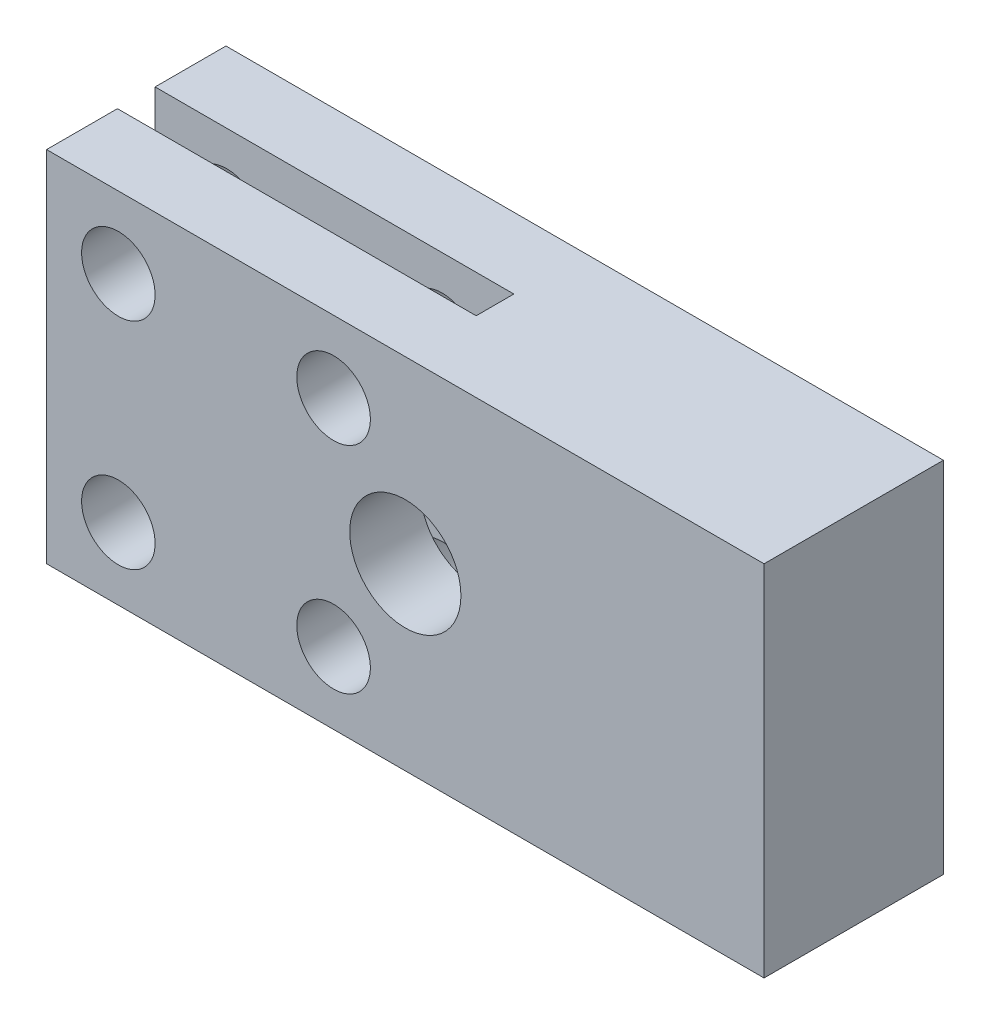
ISO-10303-21;
HEADER;
FILE_DESCRIPTION(('STEP AP214'),'2;1');
FILE_NAME('part.step','',(''),(''),'','','');
FILE_SCHEMA(('AUTOMOTIVE_DESIGN { 1 0 10303 214 1 1 1 1 }'));
ENDSEC;
DATA;
#1=APPLICATION_CONTEXT('core data for automotive mechanical design processes');
#2=APPLICATION_PROTOCOL_DEFINITION('international standard','automotive_design',2000,#1);
#3=PRODUCT_CONTEXT('',#1,'mechanical');
#4=PRODUCT('Part','Part','',(#3));
#5=PRODUCT_RELATED_PRODUCT_CATEGORY('part','',(#4));
#6=PRODUCT_DEFINITION_FORMATION('','',#4);
#7=PRODUCT_DEFINITION_CONTEXT('part definition',#1,'design');
#8=PRODUCT_DEFINITION('design','',#6,#7);
#9=PRODUCT_DEFINITION_SHAPE('','',#8);
#10=(LENGTH_UNIT() NAMED_UNIT(*) SI_UNIT(.MILLI.,.METRE.));
#11=(NAMED_UNIT(*) PLANE_ANGLE_UNIT() SI_UNIT($,.RADIAN.));
#12=(NAMED_UNIT(*) SI_UNIT($,.STERADIAN.) SOLID_ANGLE_UNIT());
#13=UNCERTAINTY_MEASURE_WITH_UNIT(LENGTH_MEASURE(1.E-05),#10,'distance_accuracy_value','');
#14=(GEOMETRIC_REPRESENTATION_CONTEXT(3) GLOBAL_UNCERTAINTY_ASSIGNED_CONTEXT((#13)) GLOBAL_UNIT_ASSIGNED_CONTEXT((#10,
#11,#12)) REPRESENTATION_CONTEXT('',''));
#15=CARTESIAN_POINT('',(0.,0.,0.));
#16=DIRECTION('',(0.,0.,1.));
#17=DIRECTION('',(1.,0.,0.));
#18=AXIS2_PLACEMENT_3D('',#15,#16,#17);
#19=CARTESIAN_POINT('',(-20.,9.99999999999998,10.));
#20=DIRECTION('',(1.,0.,0.));
#21=DIRECTION('',(0.,1.,0.));
#22=AXIS2_PLACEMENT_3D('',#19,#20,#21);
#23=PLANE('',#22);
#24=DIRECTION('',(0.,0.,-1.));
#25=VECTOR('',#24,1.);
#26=CARTESIAN_POINT('',(-20.,-10.,10.));
#27=LINE('',#26,#25);
#28=CARTESIAN_POINT('',(-20.,-10.,3.95));
#29=VERTEX_POINT('',#28);
#30=CARTESIAN_POINT('',(-20.,-10.,0.));
#31=VERTEX_POINT('',#30);
#32=EDGE_CURVE('E182',#29,#31,#27,.T.);
#33=ORIENTED_EDGE('',*,*,#32,.F.);
#34=DIRECTION('',(0.,1.,0.));
#35=VECTOR('',#34,1.);
#36=CARTESIAN_POINT('',(-20.,9.99999999999998,3.95));
#37=LINE('',#36,#35);
#38=CARTESIAN_POINT('',(-20.,10.,3.95));
#39=VERTEX_POINT('',#38);
#40=EDGE_CURVE('E145',#29,#39,#37,.T.);
#41=ORIENTED_EDGE('',*,*,#40,.T.);
#42=DIRECTION('',(0.,0.,-1.));
#43=VECTOR('',#42,1.);
#44=CARTESIAN_POINT('',(-20.,9.99999999999998,10.));
#45=LINE('',#44,#43);
#46=CARTESIAN_POINT('',(-20.,9.99999999999998,0.));
#47=VERTEX_POINT('',#46);
#48=EDGE_CURVE('E165',#39,#47,#45,.T.);
#49=ORIENTED_EDGE('',*,*,#48,.T.);
#50=DIRECTION('',(0.,-1.,0.));
#51=VECTOR('',#50,1.);
#52=CARTESIAN_POINT('',(-20.,9.99999999999998,0.));
#53=LINE('',#52,#51);
#54=EDGE_CURVE('E152',#47,#31,#53,.T.);
#55=ORIENTED_EDGE('',*,*,#54,.T.);
#56=EDGE_LOOP('',(#33,#41,#49,#55));
#57=FACE_BOUND('',#56,.T.);
#58=ADVANCED_FACE('F32',(#57),#23,.F.);
#59=CARTESIAN_POINT('',(-20.,9.99999999999998,10.));
#60=VERTEX_POINT('',#59);
#61=CARTESIAN_POINT('',(-20.,9.99999999999998,6.05));
#62=VERTEX_POINT('',#61);
#63=EDGE_CURVE('E174',#60,#62,#45,.T.);
#64=ORIENTED_EDGE('',*,*,#63,.T.);
#65=DIRECTION('',(0.,-1.,0.));
#66=VECTOR('',#65,1.);
#67=CARTESIAN_POINT('',(-20.,9.99999999999998,6.05));
#68=LINE('',#67,#66);
#69=CARTESIAN_POINT('',(-20.,-10.,6.05));
#70=VERTEX_POINT('',#69);
#71=EDGE_CURVE('E49',#62,#70,#68,.T.);
#72=ORIENTED_EDGE('',*,*,#71,.T.);
#73=CARTESIAN_POINT('',(-20.,-10.,10.));
#74=VERTEX_POINT('',#73);
#75=EDGE_CURVE('E183',#74,#70,#27,.T.);
#76=ORIENTED_EDGE('',*,*,#75,.F.);
#77=DIRECTION('',(0.,-1.,0.));
#78=VECTOR('',#77,1.);
#79=CARTESIAN_POINT('',(-20.,9.99999999999998,10.));
#80=LINE('',#79,#78);
#81=EDGE_CURVE('E155',#60,#74,#80,.T.);
#82=ORIENTED_EDGE('',*,*,#81,.F.);
#83=EDGE_LOOP('',(#64,#72,#76,#82));
#84=FACE_BOUND('',#83,.T.);
#85=ADVANCED_FACE('F34',(#84),#23,.F.);
#86=CARTESIAN_POINT('',(20.,-10.,10.));
#87=DIRECTION('',(0.,1.,0.));
#88=DIRECTION('',(0.,0.,1.));
#89=AXIS2_PLACEMENT_3D('',#86,#87,#88);
#90=PLANE('',#89);
#91=DIRECTION('',(0.,0.,1.));
#92=VECTOR('',#91,1.);
#93=CARTESIAN_POINT('',(0.,-10.,6.05));
#94=LINE('',#93,#92);
#95=CARTESIAN_POINT('',(0.,-10.,3.95));
#96=VERTEX_POINT('',#95);
#97=CARTESIAN_POINT('',(0.,-10.,6.05));
#98=VERTEX_POINT('',#97);
#99=EDGE_CURVE('E138',#96,#98,#94,.T.);
#100=ORIENTED_EDGE('',*,*,#99,.F.);
#101=DIRECTION('',(1.,0.,0.));
#102=VECTOR('',#101,1.);
#103=CARTESIAN_POINT('',(-40.,-10.,3.95));
#104=LINE('',#103,#102);
#105=EDGE_CURVE('E128',#29,#96,#104,.T.);
#106=ORIENTED_EDGE('',*,*,#105,.F.);
#107=ORIENTED_EDGE('',*,*,#32,.T.);
#108=DIRECTION('',(1.,0.,0.));
#109=VECTOR('',#108,1.);
#110=CARTESIAN_POINT('',(20.,-10.,0.));
#111=LINE('',#110,#109);
#112=CARTESIAN_POINT('',(20.,-10.,0.));
#113=VERTEX_POINT('',#112);
#114=EDGE_CURVE('E168',#31,#113,#111,.T.);
#115=ORIENTED_EDGE('',*,*,#114,.T.);
#116=DIRECTION('',(0.,0.,-1.));
#117=VECTOR('',#116,1.);
#118=CARTESIAN_POINT('',(20.,-10.,10.));
#119=LINE('',#118,#117);
#120=CARTESIAN_POINT('',(20.,-10.,10.));
#121=VERTEX_POINT('',#120);
#122=EDGE_CURVE('E179',#121,#113,#119,.T.);
#123=ORIENTED_EDGE('',*,*,#122,.F.);
#124=DIRECTION('',(1.,0.,0.));
#125=VECTOR('',#124,1.);
#126=CARTESIAN_POINT('',(20.,-10.,10.));
#127=LINE('',#126,#125);
#128=EDGE_CURVE('E158',#74,#121,#127,.T.);
#129=ORIENTED_EDGE('',*,*,#128,.F.);
#130=ORIENTED_EDGE('',*,*,#75,.T.);
#131=DIRECTION('',(-1.,0.,0.));
#132=VECTOR('',#131,1.);
#133=CARTESIAN_POINT('',(-40.,-10.,6.05));
#134=LINE('',#133,#132);
#135=EDGE_CURVE('E131',#98,#70,#134,.T.);
#136=ORIENTED_EDGE('',*,*,#135,.F.);
#137=EDGE_LOOP('',(#100,#106,#107,#115,#123,#129,#130,#136));
#138=FACE_BOUND('',#137,.T.);
#139=ADVANCED_FACE('F249',(#138),#90,.F.);
#140=CARTESIAN_POINT('',(20.,10.,10.));
#141=DIRECTION('',(-1.,0.,0.));
#142=DIRECTION('',(0.,-1.,0.));
#143=AXIS2_PLACEMENT_3D('',#140,#141,#142);
#144=PLANE('',#143);
#145=DIRECTION('',(0.,1.,0.));
#146=VECTOR('',#145,1.);
#147=CARTESIAN_POINT('',(20.,10.,0.));
#148=LINE('',#147,#146);
#149=CARTESIAN_POINT('',(20.,10.,0.));
#150=VERTEX_POINT('',#149);
#151=EDGE_CURVE('E170',#113,#150,#148,.T.);
#152=ORIENTED_EDGE('',*,*,#151,.T.);
#153=DIRECTION('',(0.,0.,-1.));
#154=VECTOR('',#153,1.);
#155=CARTESIAN_POINT('',(20.,10.,10.));
#156=LINE('',#155,#154);
#157=CARTESIAN_POINT('',(20.,10.,10.));
#158=VERTEX_POINT('',#157);
#159=EDGE_CURVE('E176',#158,#150,#156,.T.);
#160=ORIENTED_EDGE('',*,*,#159,.F.);
#161=DIRECTION('',(0.,1.,0.));
#162=VECTOR('',#161,1.);
#163=CARTESIAN_POINT('',(20.,10.,10.));
#164=LINE('',#163,#162);
#165=EDGE_CURVE('E161',#121,#158,#164,.T.);
#166=ORIENTED_EDGE('',*,*,#165,.F.);
#167=ORIENTED_EDGE('',*,*,#122,.T.);
#168=EDGE_LOOP('',(#152,#160,#166,#167));
#169=FACE_BOUND('',#168,.T.);
#170=ADVANCED_FACE('F245',(#169),#144,.F.);
#171=CARTESIAN_POINT('',(20.,10.,10.));
#172=DIRECTION('',(0.,-1.,0.));
#173=DIRECTION('',(1.,0.,0.));
#174=AXIS2_PLACEMENT_3D('',#171,#172,#173);
#175=PLANE('',#174);
#176=ORIENTED_EDGE('',*,*,#48,.F.);
#177=DIRECTION('',(1.,0.,0.));
#178=VECTOR('',#177,1.);
#179=CARTESIAN_POINT('',(-40.,10.,3.95));
#180=LINE('',#179,#178);
#181=CARTESIAN_POINT('',(0.,10.,3.95));
#182=VERTEX_POINT('',#181);
#183=EDGE_CURVE('E124',#39,#182,#180,.T.);
#184=ORIENTED_EDGE('',*,*,#183,.T.);
#185=DIRECTION('',(0.,0.,1.));
#186=VECTOR('',#185,1.);
#187=CARTESIAN_POINT('',(0.,10.,6.05));
#188=LINE('',#187,#186);
#189=CARTESIAN_POINT('',(0.,10.,6.05));
#190=VERTEX_POINT('',#189);
#191=EDGE_CURVE('E112',#182,#190,#188,.T.);
#192=ORIENTED_EDGE('',*,*,#191,.T.);
#193=DIRECTION('',(-1.,0.,0.));
#194=VECTOR('',#193,1.);
#195=CARTESIAN_POINT('',(-40.,10.,6.05));
#196=LINE('',#195,#194);
#197=EDGE_CURVE('E119',#190,#62,#196,.T.);
#198=ORIENTED_EDGE('',*,*,#197,.T.);
#199=ORIENTED_EDGE('',*,*,#63,.F.);
#200=DIRECTION('',(-1.,0.,0.));
#201=VECTOR('',#200,1.);
#202=CARTESIAN_POINT('',(20.,10.,10.));
#203=LINE('',#202,#201);
#204=EDGE_CURVE('E163',#158,#60,#203,.T.);
#205=ORIENTED_EDGE('',*,*,#204,.F.);
#206=ORIENTED_EDGE('',*,*,#159,.T.);
#207=DIRECTION('',(-1.,0.,0.));
#208=VECTOR('',#207,1.);
#209=CARTESIAN_POINT('',(20.,10.,0.));
#210=LINE('',#209,#208);
#211=EDGE_CURVE('E159',#150,#47,#210,.T.);
#212=ORIENTED_EDGE('',*,*,#211,.T.);
#213=EDGE_LOOP('',(#176,#184,#192,#198,#199,#205,#206,#212));
#214=FACE_BOUND('',#213,.T.);
#215=ADVANCED_FACE('F127',(#214),#175,.F.);
#216=CARTESIAN_POINT('',(0.,0.,10.));
#217=DIRECTION('',(0.,0.,-1.));
#218=DIRECTION('',(-1.,0.,0.));
#219=AXIS2_PLACEMENT_3D('',#216,#217,#218);
#220=PLANE('',#219);
#221=CARTESIAN_POINT('',(-4.,6.,10.));
#222=DIRECTION('',(0.,0.,-1.));
#223=DIRECTION('',(-1.,0.,0.));
#224=AXIS2_PLACEMENT_3D('',#221,#222,#223);
#225=CIRCLE('',#224,2.05);
#226=CARTESIAN_POINT('',(-6.05,6.,10.));
#227=VERTEX_POINT('',#226);
#228=EDGE_CURVE('E199',#227,#227,#225,.T.);
#229=ORIENTED_EDGE('',*,*,#228,.T.);
#230=EDGE_LOOP('',(#229));
#231=FACE_BOUND('',#230,.T.);
#232=CARTESIAN_POINT('',(-4.,-6.,10.));
#233=DIRECTION('',(0.,0.,-1.));
#234=DIRECTION('',(-1.,0.,0.));
#235=AXIS2_PLACEMENT_3D('',#232,#233,#234);
#236=CIRCLE('',#235,2.05);
#237=CARTESIAN_POINT('',(-6.05,-6.,10.));
#238=VERTEX_POINT('',#237);
#239=EDGE_CURVE('E433',#238,#238,#236,.T.);
#240=ORIENTED_EDGE('',*,*,#239,.T.);
#241=EDGE_LOOP('',(#240));
#242=FACE_BOUND('',#241,.T.);
#243=CARTESIAN_POINT('',(-16.,-6.,10.));
#244=DIRECTION('',(0.,0.,-1.));
#245=DIRECTION('',(-1.,0.,0.));
#246=AXIS2_PLACEMENT_3D('',#243,#244,#245);
#247=CIRCLE('',#246,2.05);
#248=CARTESIAN_POINT('',(-18.05,-6.,10.));
#249=VERTEX_POINT('',#248);
#250=EDGE_CURVE('E441',#249,#249,#247,.T.);
#251=ORIENTED_EDGE('',*,*,#250,.T.);
#252=EDGE_LOOP('',(#251));
#253=FACE_BOUND('',#252,.T.);
#254=CARTESIAN_POINT('',(-16.,6.,10.));
#255=DIRECTION('',(0.,0.,-1.));
#256=DIRECTION('',(-1.,0.,0.));
#257=AXIS2_PLACEMENT_3D('',#254,#255,#256);
#258=CIRCLE('',#257,2.05);
#259=CARTESIAN_POINT('',(-18.05,6.,10.));
#260=VERTEX_POINT('',#259);
#261=EDGE_CURVE('E195',#260,#260,#258,.T.);
#262=ORIENTED_EDGE('',*,*,#261,.T.);
#263=EDGE_LOOP('',(#262));
#264=FACE_BOUND('',#263,.T.);
#265=CARTESIAN_POINT('',(0.,0.,10.));
#266=DIRECTION('',(0.,0.,1.));
#267=DIRECTION('',(1.,0.,0.));
#268=AXIS2_PLACEMENT_3D('',#265,#266,#267);
#269=CIRCLE('',#268,3.1);
#270=CARTESIAN_POINT('',(3.1,0.,10.));
#271=VERTEX_POINT('',#270);
#272=EDGE_CURVE('E148',#271,#271,#269,.T.);
#273=ORIENTED_EDGE('',*,*,#272,.F.);
#274=EDGE_LOOP('',(#273));
#275=FACE_BOUND('',#274,.T.);
#276=ORIENTED_EDGE('',*,*,#81,.T.);
#277=ORIENTED_EDGE('',*,*,#128,.T.);
#278=ORIENTED_EDGE('',*,*,#165,.T.);
#279=ORIENTED_EDGE('',*,*,#204,.T.);
#280=EDGE_LOOP('',(#276,#277,#278,#279));
#281=FACE_BOUND('',#280,.T.);
#282=ADVANCED_FACE('F230',(#231,#242,#253,#264,#275,#281),#220,.F.);
#283=CARTESIAN_POINT('',(0.,0.,0.));
#284=DIRECTION('',(0.,0.,-1.));
#285=DIRECTION('',(-1.,0.,0.));
#286=AXIS2_PLACEMENT_3D('',#283,#284,#285);
#287=PLANE('',#286);
#288=CARTESIAN_POINT('',(-4.,6.,0.));
#289=DIRECTION('',(0.,0.,-1.));
#290=DIRECTION('',(-1.,0.,0.));
#291=AXIS2_PLACEMENT_3D('',#288,#289,#290);
#292=CIRCLE('',#291,2.05);
#293=CARTESIAN_POINT('',(-6.05,6.,0.));
#294=VERTEX_POINT('',#293);
#295=EDGE_CURVE('E425',#294,#294,#292,.T.);
#296=ORIENTED_EDGE('',*,*,#295,.F.);
#297=EDGE_LOOP('',(#296));
#298=FACE_BOUND('',#297,.T.);
#299=CARTESIAN_POINT('',(-4.,-6.,0.));
#300=DIRECTION('',(0.,0.,-1.));
#301=DIRECTION('',(-1.,0.,0.));
#302=AXIS2_PLACEMENT_3D('',#299,#300,#301);
#303=CIRCLE('',#302,2.05);
#304=CARTESIAN_POINT('',(-6.05,-6.,0.));
#305=VERTEX_POINT('',#304);
#306=EDGE_CURVE('E437',#305,#305,#303,.T.);
#307=ORIENTED_EDGE('',*,*,#306,.F.);
#308=EDGE_LOOP('',(#307));
#309=FACE_BOUND('',#308,.T.);
#310=CARTESIAN_POINT('',(-16.,-6.,0.));
#311=DIRECTION('',(0.,0.,-1.));
#312=DIRECTION('',(-1.,0.,0.));
#313=AXIS2_PLACEMENT_3D('',#310,#311,#312);
#314=CIRCLE('',#313,2.05);
#315=CARTESIAN_POINT('',(-18.05,-6.,0.));
#316=VERTEX_POINT('',#315);
#317=EDGE_CURVE('E212',#316,#316,#314,.T.);
#318=ORIENTED_EDGE('',*,*,#317,.F.);
#319=EDGE_LOOP('',(#318));
#320=FACE_BOUND('',#319,.T.);
#321=CARTESIAN_POINT('',(-16.,6.,0.));
#322=DIRECTION('',(0.,0.,-1.));
#323=DIRECTION('',(-1.,0.,0.));
#324=AXIS2_PLACEMENT_3D('',#321,#322,#323);
#325=CIRCLE('',#324,2.05);
#326=CARTESIAN_POINT('',(-18.05,6.,0.));
#327=VERTEX_POINT('',#326);
#328=EDGE_CURVE('E218',#327,#327,#325,.T.);
#329=ORIENTED_EDGE('',*,*,#328,.F.);
#330=EDGE_LOOP('',(#329));
#331=FACE_BOUND('',#330,.T.);
#332=CARTESIAN_POINT('',(0.,0.,0.));
#333=DIRECTION('',(0.,0.,1.));
#334=DIRECTION('',(1.,0.,0.));
#335=AXIS2_PLACEMENT_3D('',#332,#333,#334);
#336=CIRCLE('',#335,3.1);
#337=CARTESIAN_POINT('',(3.1,0.,0.));
#338=VERTEX_POINT('',#337);
#339=EDGE_CURVE('E149',#338,#338,#336,.T.);
#340=ORIENTED_EDGE('',*,*,#339,.T.);
#341=EDGE_LOOP('',(#340));
#342=FACE_BOUND('',#341,.T.);
#343=ORIENTED_EDGE('',*,*,#54,.F.);
#344=ORIENTED_EDGE('',*,*,#211,.F.);
#345=ORIENTED_EDGE('',*,*,#151,.F.);
#346=ORIENTED_EDGE('',*,*,#114,.F.);
#347=EDGE_LOOP('',(#343,#344,#345,#346));
#348=FACE_BOUND('',#347,.T.);
#349=ADVANCED_FACE('F226',(#298,#309,#320,#331,#342,#348),#287,.T.);
#350=CARTESIAN_POINT('',(0.,0.,0.));
#351=DIRECTION('',(0.,0.,1.));
#352=DIRECTION('',(1.,0.,0.));
#353=AXIS2_PLACEMENT_3D('',#350,#351,#352);
#354=CYLINDRICAL_SURFACE('',#353,3.1);
#355=DIRECTION('',(0.,0.,1.));
#356=VECTOR('',#355,1.);
#357=CARTESIAN_POINT('',(0.,3.1,0.));
#358=LINE('',#357,#356);
#359=CARTESIAN_POINT('',(0.,3.1,6.05));
#360=VERTEX_POINT('',#359);
#361=CARTESIAN_POINT('',(0.,3.1,3.95));
#362=VERTEX_POINT('',#361);
#363=EDGE_CURVE('E41',#360,#362,#358,.F.);
#364=ORIENTED_EDGE('',*,*,#363,.T.);
#365=CARTESIAN_POINT('',(0.,0.,3.95));
#366=DIRECTION('',(0.,0.,-1.));
#367=DIRECTION('',(-1.,0.,0.));
#368=AXIS2_PLACEMENT_3D('',#365,#366,#367);
#369=CIRCLE('',#368,3.1);
#370=CARTESIAN_POINT('',(0.,-3.1,3.95));
#371=VERTEX_POINT('',#370);
#372=EDGE_CURVE('E11',#362,#371,#369,.F.);
#373=ORIENTED_EDGE('',*,*,#372,.T.);
#374=DIRECTION('',(0.,0.,1.));
#375=VECTOR('',#374,1.);
#376=CARTESIAN_POINT('',(0.,-3.1,0.));
#377=LINE('',#376,#375);
#378=CARTESIAN_POINT('',(0.,-3.1,6.05));
#379=VERTEX_POINT('',#378);
#380=EDGE_CURVE('E188',#371,#379,#377,.T.);
#381=ORIENTED_EDGE('',*,*,#380,.T.);
#382=CARTESIAN_POINT('',(0.,0.,6.05));
#383=DIRECTION('',(0.,0.,1.));
#384=DIRECTION('',(1.,0.,0.));
#385=AXIS2_PLACEMENT_3D('',#382,#383,#384);
#386=CIRCLE('',#385,3.1);
#387=EDGE_CURVE('E186',#379,#360,#386,.F.);
#388=ORIENTED_EDGE('',*,*,#387,.T.);
#389=EDGE_LOOP('',(#364,#373,#381,#388));
#390=FACE_BOUND('',#389,.T.);
#391=ORIENTED_EDGE('',*,*,#339,.F.);
#392=EDGE_LOOP('',(#391));
#393=FACE_BOUND('',#392,.T.);
#394=ORIENTED_EDGE('',*,*,#272,.T.);
#395=EDGE_LOOP('',(#394));
#396=FACE_BOUND('',#395,.T.);
#397=ADVANCED_FACE('F229',(#390,#393,#396),#354,.F.);
#398=CARTESIAN_POINT('',(0.,10.,6.05));
#399=DIRECTION('',(1.,0.,0.));
#400=DIRECTION('',(0.,0.,-1.));
#401=AXIS2_PLACEMENT_3D('',#398,#399,#400);
#402=PLANE('',#401);
#403=DIRECTION('',(0.,-1.,0.));
#404=VECTOR('',#403,1.);
#405=CARTESIAN_POINT('',(0.,10.,6.05));
#406=LINE('',#405,#404);
#407=EDGE_CURVE('E55',#190,#360,#406,.T.);
#408=ORIENTED_EDGE('',*,*,#407,.F.);
#409=ORIENTED_EDGE('',*,*,#191,.F.);
#410=DIRECTION('',(0.,-1.,0.));
#411=VECTOR('',#410,1.);
#412=CARTESIAN_POINT('',(0.,10.,3.95));
#413=LINE('',#412,#411);
#414=EDGE_CURVE('E142',#182,#362,#413,.T.);
#415=ORIENTED_EDGE('',*,*,#414,.T.);
#416=ORIENTED_EDGE('',*,*,#363,.F.);
#417=EDGE_LOOP('',(#408,#409,#415,#416));
#418=FACE_BOUND('',#417,.T.);
#419=ADVANCED_FACE('F109',(#418),#402,.F.);
#420=EDGE_CURVE('E116',#371,#96,#413,.T.);
#421=ORIENTED_EDGE('',*,*,#420,.T.);
#422=ORIENTED_EDGE('',*,*,#99,.T.);
#423=EDGE_CURVE('E117',#379,#98,#406,.T.);
#424=ORIENTED_EDGE('',*,*,#423,.F.);
#425=ORIENTED_EDGE('',*,*,#380,.F.);
#426=EDGE_LOOP('',(#421,#422,#424,#425));
#427=FACE_BOUND('',#426,.T.);
#428=ADVANCED_FACE('F259',(#427),#402,.F.);
#429=CARTESIAN_POINT('',(-40.,10.,3.95));
#430=DIRECTION('',(0.,0.,-1.));
#431=DIRECTION('',(-1.,0.,0.));
#432=AXIS2_PLACEMENT_3D('',#429,#430,#431);
#433=PLANE('',#432);
#434=CARTESIAN_POINT('',(-4.,6.,3.95));
#435=DIRECTION('',(0.,0.,-1.));
#436=DIRECTION('',(-1.,0.,0.));
#437=AXIS2_PLACEMENT_3D('',#434,#435,#436);
#438=CIRCLE('',#437,2.05);
#439=CARTESIAN_POINT('',(-6.05,6.,3.95));
#440=VERTEX_POINT('',#439);
#441=EDGE_CURVE('E215',#440,#440,#438,.T.);
#442=ORIENTED_EDGE('',*,*,#441,.T.);
#443=EDGE_LOOP('',(#442));
#444=FACE_BOUND('',#443,.T.);
#445=CARTESIAN_POINT('',(-4.,-6.,3.95));
#446=DIRECTION('',(0.,0.,-1.));
#447=DIRECTION('',(-1.,0.,0.));
#448=AXIS2_PLACEMENT_3D('',#445,#446,#447);
#449=CIRCLE('',#448,2.05);
#450=CARTESIAN_POINT('',(-6.05,-6.,3.95));
#451=VERTEX_POINT('',#450);
#452=EDGE_CURVE('E202',#451,#451,#449,.T.);
#453=ORIENTED_EDGE('',*,*,#452,.T.);
#454=EDGE_LOOP('',(#453));
#455=FACE_BOUND('',#454,.T.);
#456=CARTESIAN_POINT('',(-16.,-6.,3.95));
#457=DIRECTION('',(0.,0.,-1.));
#458=DIRECTION('',(-1.,0.,0.));
#459=AXIS2_PLACEMENT_3D('',#456,#457,#458);
#460=CIRCLE('',#459,2.05);
#461=CARTESIAN_POINT('',(-18.05,-6.,3.95));
#462=VERTEX_POINT('',#461);
#463=EDGE_CURVE('E198',#462,#462,#460,.T.);
#464=ORIENTED_EDGE('',*,*,#463,.T.);
#465=EDGE_LOOP('',(#464));
#466=FACE_BOUND('',#465,.T.);
#467=CARTESIAN_POINT('',(-16.,6.,3.95));
#468=DIRECTION('',(0.,0.,-1.));
#469=DIRECTION('',(-1.,0.,0.));
#470=AXIS2_PLACEMENT_3D('',#467,#468,#469);
#471=CIRCLE('',#470,2.05);
#472=CARTESIAN_POINT('',(-18.05,6.,3.95));
#473=VERTEX_POINT('',#472);
#474=EDGE_CURVE('E134',#473,#473,#471,.T.);
#475=ORIENTED_EDGE('',*,*,#474,.T.);
#476=EDGE_LOOP('',(#475));
#477=FACE_BOUND('',#476,.T.);
#478=ORIENTED_EDGE('',*,*,#105,.T.);
#479=ORIENTED_EDGE('',*,*,#420,.F.);
#480=ORIENTED_EDGE('',*,*,#372,.F.);
#481=ORIENTED_EDGE('',*,*,#414,.F.);
#482=ORIENTED_EDGE('',*,*,#183,.F.);
#483=ORIENTED_EDGE('',*,*,#40,.F.);
#484=EDGE_LOOP('',(#478,#479,#480,#481,#482,#483));
#485=FACE_BOUND('',#484,.T.);
#486=ADVANCED_FACE('F254',(#444,#455,#466,#477,#485),#433,.F.);
#487=CARTESIAN_POINT('',(-40.,10.,6.05));
#488=DIRECTION('',(0.,0.,1.));
#489=DIRECTION('',(1.,0.,0.));
#490=AXIS2_PLACEMENT_3D('',#487,#488,#489);
#491=PLANE('',#490);
#492=CARTESIAN_POINT('',(-4.,6.,6.05));
#493=DIRECTION('',(0.,0.,1.));
#494=DIRECTION('',(1.,0.,0.));
#495=AXIS2_PLACEMENT_3D('',#492,#493,#494);
#496=CIRCLE('',#495,2.05);
#497=CARTESIAN_POINT('',(-1.95,6.,6.05));
#498=VERTEX_POINT('',#497);
#499=EDGE_CURVE('E36',#498,#498,#496,.T.);
#500=ORIENTED_EDGE('',*,*,#499,.T.);
#501=EDGE_LOOP('',(#500));
#502=FACE_BOUND('',#501,.T.);
#503=CARTESIAN_POINT('',(-4.,-6.,6.05));
#504=DIRECTION('',(0.,0.,1.));
#505=DIRECTION('',(1.,0.,0.));
#506=AXIS2_PLACEMENT_3D('',#503,#504,#505);
#507=CIRCLE('',#506,2.05);
#508=CARTESIAN_POINT('',(-1.95,-6.,6.05));
#509=VERTEX_POINT('',#508);
#510=EDGE_CURVE('E200',#509,#509,#507,.T.);
#511=ORIENTED_EDGE('',*,*,#510,.T.);
#512=EDGE_LOOP('',(#511));
#513=FACE_BOUND('',#512,.T.);
#514=CARTESIAN_POINT('',(-16.,-6.,6.05));
#515=DIRECTION('',(0.,0.,1.));
#516=DIRECTION('',(1.,0.,0.));
#517=AXIS2_PLACEMENT_3D('',#514,#515,#516);
#518=CIRCLE('',#517,2.05);
#519=CARTESIAN_POINT('',(-13.95,-6.,6.05));
#520=VERTEX_POINT('',#519);
#521=EDGE_CURVE('E196',#520,#520,#518,.T.);
#522=ORIENTED_EDGE('',*,*,#521,.T.);
#523=EDGE_LOOP('',(#522));
#524=FACE_BOUND('',#523,.T.);
#525=CARTESIAN_POINT('',(-16.,6.,6.05));
#526=DIRECTION('',(0.,0.,1.));
#527=DIRECTION('',(1.,0.,0.));
#528=AXIS2_PLACEMENT_3D('',#525,#526,#527);
#529=CIRCLE('',#528,2.05);
#530=CARTESIAN_POINT('',(-13.95,6.,6.05));
#531=VERTEX_POINT('',#530);
#532=EDGE_CURVE('E192',#531,#531,#529,.T.);
#533=ORIENTED_EDGE('',*,*,#532,.T.);
#534=EDGE_LOOP('',(#533));
#535=FACE_BOUND('',#534,.T.);
#536=ORIENTED_EDGE('',*,*,#197,.F.);
#537=ORIENTED_EDGE('',*,*,#407,.T.);
#538=ORIENTED_EDGE('',*,*,#387,.F.);
#539=ORIENTED_EDGE('',*,*,#423,.T.);
#540=ORIENTED_EDGE('',*,*,#135,.T.);
#541=ORIENTED_EDGE('',*,*,#71,.F.);
#542=EDGE_LOOP('',(#536,#537,#538,#539,#540,#541));
#543=FACE_BOUND('',#542,.T.);
#544=ADVANCED_FACE('F120',(#502,#513,#524,#535,#543),#491,.F.);
#545=CARTESIAN_POINT('',(-16.,6.,10.));
#546=DIRECTION('',(0.,0.,-1.));
#547=DIRECTION('',(-1.,0.,0.));
#548=AXIS2_PLACEMENT_3D('',#545,#546,#547);
#549=CYLINDRICAL_SURFACE('',#548,2.05);
#550=ORIENTED_EDGE('',*,*,#261,.F.);
#551=EDGE_LOOP('',(#550));
#552=FACE_BOUND('',#551,.T.);
#553=ORIENTED_EDGE('',*,*,#532,.F.);
#554=EDGE_LOOP('',(#553));
#555=FACE_BOUND('',#554,.T.);
#556=ADVANCED_FACE('F344',(#552,#555),#549,.F.);
#557=ORIENTED_EDGE('',*,*,#328,.T.);
#558=EDGE_LOOP('',(#557));
#559=FACE_BOUND('',#558,.T.);
#560=ORIENTED_EDGE('',*,*,#474,.F.);
#561=EDGE_LOOP('',(#560));
#562=FACE_BOUND('',#561,.T.);
#563=ADVANCED_FACE('F223',(#559,#562),#549,.F.);
#564=CARTESIAN_POINT('',(-16.,-6.,10.));
#565=DIRECTION('',(0.,0.,-1.));
#566=DIRECTION('',(-1.,0.,0.));
#567=AXIS2_PLACEMENT_3D('',#564,#565,#566);
#568=CYLINDRICAL_SURFACE('',#567,2.05);
#569=ORIENTED_EDGE('',*,*,#250,.F.);
#570=EDGE_LOOP('',(#569));
#571=FACE_BOUND('',#570,.T.);
#572=ORIENTED_EDGE('',*,*,#521,.F.);
#573=EDGE_LOOP('',(#572));
#574=FACE_BOUND('',#573,.T.);
#575=ADVANCED_FACE('F363',(#571,#574),#568,.F.);
#576=CARTESIAN_POINT('',(-4.,-6.,10.));
#577=DIRECTION('',(0.,0.,-1.));
#578=DIRECTION('',(-1.,0.,0.));
#579=AXIS2_PLACEMENT_3D('',#576,#577,#578);
#580=CYLINDRICAL_SURFACE('',#579,2.05);
#581=ORIENTED_EDGE('',*,*,#239,.F.);
#582=EDGE_LOOP('',(#581));
#583=FACE_BOUND('',#582,.T.);
#584=ORIENTED_EDGE('',*,*,#510,.F.);
#585=EDGE_LOOP('',(#584));
#586=FACE_BOUND('',#585,.T.);
#587=ADVANCED_FACE('F371',(#583,#586),#580,.F.);
#588=CARTESIAN_POINT('',(-4.,6.,10.));
#589=DIRECTION('',(0.,0.,-1.));
#590=DIRECTION('',(-1.,0.,0.));
#591=AXIS2_PLACEMENT_3D('',#588,#589,#590);
#592=CYLINDRICAL_SURFACE('',#591,2.05);
#593=ORIENTED_EDGE('',*,*,#228,.F.);
#594=EDGE_LOOP('',(#593));
#595=FACE_BOUND('',#594,.T.);
#596=ORIENTED_EDGE('',*,*,#499,.F.);
#597=EDGE_LOOP('',(#596));
#598=FACE_BOUND('',#597,.T.);
#599=ADVANCED_FACE('F382',(#595,#598),#592,.F.);
#600=ORIENTED_EDGE('',*,*,#317,.T.);
#601=EDGE_LOOP('',(#600));
#602=FACE_BOUND('',#601,.T.);
#603=ORIENTED_EDGE('',*,*,#463,.F.);
#604=EDGE_LOOP('',(#603));
#605=FACE_BOUND('',#604,.T.);
#606=ADVANCED_FACE('F374',(#602,#605),#568,.F.);
#607=ORIENTED_EDGE('',*,*,#306,.T.);
#608=EDGE_LOOP('',(#607));
#609=FACE_BOUND('',#608,.T.);
#610=ORIENTED_EDGE('',*,*,#452,.F.);
#611=EDGE_LOOP('',(#610));
#612=FACE_BOUND('',#611,.T.);
#613=ADVANCED_FACE('F385',(#609,#612),#580,.F.);
#614=ORIENTED_EDGE('',*,*,#295,.T.);
#615=EDGE_LOOP('',(#614));
#616=FACE_BOUND('',#615,.T.);
#617=ORIENTED_EDGE('',*,*,#441,.F.);
#618=EDGE_LOOP('',(#617));
#619=FACE_BOUND('',#618,.T.);
#620=ADVANCED_FACE('F395',(#616,#619),#592,.F.);
#621=CLOSED_SHELL('',(#58,#85,#139,#170,#215,#282,#349,#397,#419,#428,#486,#544,#556,#563,#575,
#587,#599,#606,#613,#620));
#622=MANIFOLD_SOLID_BREP('B2',#621);
#623=ADVANCED_BREP_SHAPE_REPRESENTATION('',(#18,#622),#14);
#624=SHAPE_DEFINITION_REPRESENTATION(#9,#623);
ENDSEC;
END-ISO-10303-21;
